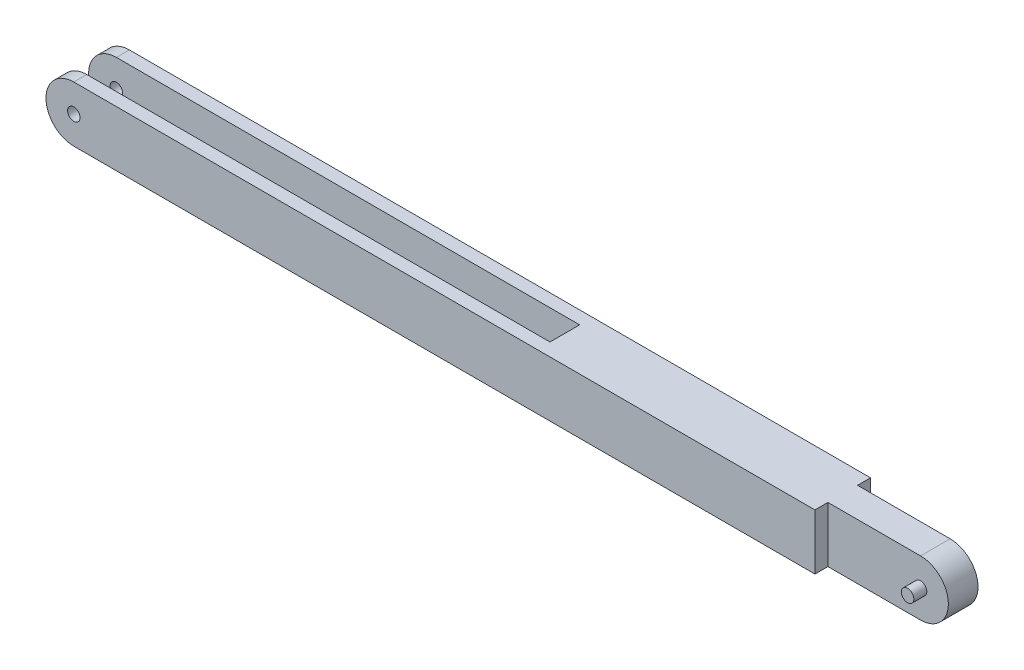
ISO-10303-21;
HEADER;
FILE_DESCRIPTION(('STEP AP214'),'2;1');
FILE_NAME('part.step','',(''),(''),'','','');
FILE_SCHEMA(('AUTOMOTIVE_DESIGN { 1 0 10303 214 1 1 1 1 }'));
ENDSEC;
DATA;
#1=APPLICATION_CONTEXT('core data for automotive mechanical design processes');
#2=APPLICATION_PROTOCOL_DEFINITION('international standard','automotive_design',2000,#1);
#3=PRODUCT_CONTEXT('',#1,'mechanical');
#4=PRODUCT('Part','Part','',(#3));
#5=PRODUCT_RELATED_PRODUCT_CATEGORY('part','',(#4));
#6=PRODUCT_DEFINITION_FORMATION('','',#4);
#7=PRODUCT_DEFINITION_CONTEXT('part definition',#1,'design');
#8=PRODUCT_DEFINITION('design','',#6,#7);
#9=PRODUCT_DEFINITION_SHAPE('','',#8);
#10=(LENGTH_UNIT() NAMED_UNIT(*) SI_UNIT(.MILLI.,.METRE.));
#11=(NAMED_UNIT(*) PLANE_ANGLE_UNIT() SI_UNIT($,.RADIAN.));
#12=(NAMED_UNIT(*) SI_UNIT($,.STERADIAN.) SOLID_ANGLE_UNIT());
#13=UNCERTAINTY_MEASURE_WITH_UNIT(LENGTH_MEASURE(1.E-05),#10,'distance_accuracy_value','');
#14=(GEOMETRIC_REPRESENTATION_CONTEXT(3) GLOBAL_UNCERTAINTY_ASSIGNED_CONTEXT((#13)) GLOBAL_UNIT_ASSIGNED_CONTEXT((#10,
#11,#12)) REPRESENTATION_CONTEXT('',''));
#15=CARTESIAN_POINT('',(0.,0.,0.));
#16=DIRECTION('',(0.,0.,1.));
#17=DIRECTION('',(1.,0.,0.));
#18=AXIS2_PLACEMENT_3D('',#15,#16,#17);
#19=CARTESIAN_POINT('',(-225.,0.,15.));
#20=DIRECTION('',(0.,0.,-1.));
#21=DIRECTION('',(-1.,0.,0.));
#22=AXIS2_PLACEMENT_3D('',#19,#20,#21);
#23=CYLINDRICAL_SURFACE('',#22,15.);
#24=DIRECTION('',(0.,0.,-1.));
#25=VECTOR('',#24,1.);
#26=CARTESIAN_POINT('',(-225.,-15.,15.));
#27=LINE('',#26,#25);
#28=CARTESIAN_POINT('',(-225.,-15.0000000000001,-7.99999999999993));
#29=VERTEX_POINT('',#28);
#30=CARTESIAN_POINT('',(-225.,-15.,-15.));
#31=VERTEX_POINT('',#30);
#32=EDGE_CURVE('E226',#29,#31,#27,.T.);
#33=ORIENTED_EDGE('',*,*,#32,.F.);
#34=CARTESIAN_POINT('',(-225.,0.,-7.99999999999993));
#35=DIRECTION('',(0.,0.,-1.));
#36=DIRECTION('',(-1.,0.,0.));
#37=AXIS2_PLACEMENT_3D('',#34,#35,#36);
#38=CIRCLE('',#37,15.);
#39=CARTESIAN_POINT('',(-225.,15.,-7.99999999999993));
#40=VERTEX_POINT('',#39);
#41=EDGE_CURVE('E182',#29,#40,#38,.T.);
#42=ORIENTED_EDGE('',*,*,#41,.T.);
#43=DIRECTION('',(0.,0.,-1.));
#44=VECTOR('',#43,1.);
#45=CARTESIAN_POINT('',(-225.,15.,15.));
#46=LINE('',#45,#44);
#47=CARTESIAN_POINT('',(-225.,15.,-15.));
#48=VERTEX_POINT('',#47);
#49=EDGE_CURVE('E209',#40,#48,#46,.T.);
#50=ORIENTED_EDGE('',*,*,#49,.T.);
#51=CARTESIAN_POINT('',(-225.,0.,-15.));
#52=DIRECTION('',(0.,0.,1.));
#53=DIRECTION('',(1.,0.,0.));
#54=AXIS2_PLACEMENT_3D('',#51,#52,#53);
#55=CIRCLE('',#54,15.);
#56=EDGE_CURVE('E199',#48,#31,#55,.T.);
#57=ORIENTED_EDGE('',*,*,#56,.T.);
#58=EDGE_LOOP('',(#33,#42,#50,#57));
#59=FACE_BOUND('',#58,.T.);
#60=ADVANCED_FACE('F33',(#59),#23,.T.);
#61=CARTESIAN_POINT('',(-225.,0.,15.));
#62=DIRECTION('',(0.,0.,1.));
#63=DIRECTION('',(1.,0.,0.));
#64=AXIS2_PLACEMENT_3D('',#61,#62,#63);
#65=CYLINDRICAL_SURFACE('',#64,3.3782);
#66=CARTESIAN_POINT('',(-225.,0.,-7.99999999999993));
#67=DIRECTION('',(0.,0.,-1.));
#68=DIRECTION('',(-1.,0.,0.));
#69=AXIS2_PLACEMENT_3D('',#66,#67,#68);
#70=CIRCLE('',#69,3.3782);
#71=CARTESIAN_POINT('',(-228.3782,0.,-7.99999999999993));
#72=VERTEX_POINT('',#71);
#73=EDGE_CURVE('E181',#72,#72,#70,.F.);
#74=ORIENTED_EDGE('',*,*,#73,.T.);
#75=EDGE_LOOP('',(#74));
#76=FACE_BOUND('',#75,.T.);
#77=CARTESIAN_POINT('',(-225.,0.,-15.));
#78=DIRECTION('',(0.,0.,1.));
#79=DIRECTION('',(1.,0.,0.));
#80=AXIS2_PLACEMENT_3D('',#77,#78,#79);
#81=CIRCLE('',#80,3.3782);
#82=CARTESIAN_POINT('',(-221.6218,0.,-15.));
#83=VERTEX_POINT('',#82);
#84=EDGE_CURVE('E196',#83,#83,#81,.T.);
#85=ORIENTED_EDGE('',*,*,#84,.F.);
#86=EDGE_LOOP('',(#85));
#87=FACE_BOUND('',#86,.T.);
#88=ADVANCED_FACE('F280',(#76,#87),#65,.F.);
#89=CARTESIAN_POINT('',(-225.,15.,15.));
#90=VERTEX_POINT('',#89);
#91=CARTESIAN_POINT('',(-225.,15.,8.00000000000001));
#92=VERTEX_POINT('',#91);
#93=EDGE_CURVE('E217',#90,#92,#46,.T.);
#94=ORIENTED_EDGE('',*,*,#93,.T.);
#95=CARTESIAN_POINT('',(-225.,0.,8.00000000000001));
#96=DIRECTION('',(0.,0.,1.));
#97=DIRECTION('',(1.,0.,0.));
#98=AXIS2_PLACEMENT_3D('',#95,#96,#97);
#99=CIRCLE('',#98,15.);
#100=CARTESIAN_POINT('',(-225.,-15.0000000000001,8.00000000000001));
#101=VERTEX_POINT('',#100);
#102=EDGE_CURVE('E48',#92,#101,#99,.T.);
#103=ORIENTED_EDGE('',*,*,#102,.T.);
#104=CARTESIAN_POINT('',(-225.,-15.,15.));
#105=VERTEX_POINT('',#104);
#106=EDGE_CURVE('E142',#105,#101,#27,.T.);
#107=ORIENTED_EDGE('',*,*,#106,.F.);
#108=CARTESIAN_POINT('',(-225.,0.,15.));
#109=DIRECTION('',(0.,0.,1.));
#110=DIRECTION('',(1.,0.,0.));
#111=AXIS2_PLACEMENT_3D('',#108,#109,#110);
#112=CIRCLE('',#111,15.);
#113=EDGE_CURVE('E200',#90,#105,#112,.T.);
#114=ORIENTED_EDGE('',*,*,#113,.F.);
#115=EDGE_LOOP('',(#94,#103,#107,#114));
#116=FACE_BOUND('',#115,.T.);
#117=ADVANCED_FACE('F35',(#116),#23,.T.);
#118=CARTESIAN_POINT('',(-225.,-15.,15.));
#119=DIRECTION('',(0.,1.,0.));
#120=DIRECTION('',(-1.,0.,0.));
#121=AXIS2_PLACEMENT_3D('',#118,#119,#120);
#122=PLANE('',#121);
#123=DIRECTION('',(0.,0.,-1.));
#124=VECTOR('',#123,1.);
#125=CARTESIAN_POINT('',(25.,-15.,-7.99999999999999));
#126=LINE('',#125,#124);
#127=CARTESIAN_POINT('',(25.,-15.,8.00000000000001));
#128=VERTEX_POINT('',#127);
#129=CARTESIAN_POINT('',(25.,-15.,-7.99999999999999));
#130=VERTEX_POINT('',#129);
#131=EDGE_CURVE('E133',#128,#130,#126,.T.);
#132=ORIENTED_EDGE('',*,*,#131,.T.);
#133=DIRECTION('',(-1.,0.,0.));
#134=VECTOR('',#133,1.);
#135=CARTESIAN_POINT('',(-975.,-15.0000000000002,-7.99999999999976));
#136=LINE('',#135,#134);
#137=EDGE_CURVE('E130',#130,#29,#136,.T.);
#138=ORIENTED_EDGE('',*,*,#137,.T.);
#139=ORIENTED_EDGE('',*,*,#32,.T.);
#140=DIRECTION('',(1.,0.,0.));
#141=VECTOR('',#140,1.);
#142=CARTESIAN_POINT('',(-225.,-15.,-15.));
#143=LINE('',#142,#141);
#144=CARTESIAN_POINT('',(175.,-14.9999999999999,-15.));
#145=VERTEX_POINT('',#144);
#146=EDGE_CURVE('E212',#31,#145,#143,.T.);
#147=ORIENTED_EDGE('',*,*,#146,.T.);
#148=DIRECTION('',(0.,0.,1.));
#149=VECTOR('',#148,1.);
#150=CARTESIAN_POINT('',(175.,-15.,-28.9161112376696));
#151=LINE('',#150,#149);
#152=CARTESIAN_POINT('',(175.,-15.,-8.));
#153=VERTEX_POINT('',#152);
#154=EDGE_CURVE('E157',#145,#153,#151,.T.);
#155=ORIENTED_EDGE('',*,*,#154,.T.);
#156=DIRECTION('',(1.,0.,0.));
#157=VECTOR('',#156,1.);
#158=CARTESIAN_POINT('',(175.,-15.,-8.));
#159=LINE('',#158,#157);
#160=CARTESIAN_POINT('',(225.,-15.,-8.));
#161=VERTEX_POINT('',#160);
#162=EDGE_CURVE('E160',#153,#161,#159,.T.);
#163=ORIENTED_EDGE('',*,*,#162,.T.);
#164=DIRECTION('',(0.,0.,-1.));
#165=VECTOR('',#164,1.);
#166=CARTESIAN_POINT('',(225.,-14.9999999999999,15.));
#167=LINE('',#166,#165);
#168=CARTESIAN_POINT('',(225.,-15.,8.));
#169=VERTEX_POINT('',#168);
#170=EDGE_CURVE('E223',#169,#161,#167,.T.);
#171=ORIENTED_EDGE('',*,*,#170,.F.);
#172=DIRECTION('',(-1.,0.,0.));
#173=VECTOR('',#172,1.);
#174=CARTESIAN_POINT('',(175.,-15.,8.));
#175=LINE('',#174,#173);
#176=CARTESIAN_POINT('',(175.,-15.,8.));
#177=VERTEX_POINT('',#176);
#178=EDGE_CURVE('E173',#169,#177,#175,.T.);
#179=ORIENTED_EDGE('',*,*,#178,.T.);
#180=DIRECTION('',(0.,0.,1.));
#181=VECTOR('',#180,1.);
#182=CARTESIAN_POINT('',(175.,-15.,28.9161112376696));
#183=LINE('',#182,#181);
#184=CARTESIAN_POINT('',(175.,-15.,15.));
#185=VERTEX_POINT('',#184);
#186=EDGE_CURVE('E170',#177,#185,#183,.T.);
#187=ORIENTED_EDGE('',*,*,#186,.T.);
#188=DIRECTION('',(1.,0.,0.));
#189=VECTOR('',#188,1.);
#190=CARTESIAN_POINT('',(-225.,-15.,15.));
#191=LINE('',#190,#189);
#192=EDGE_CURVE('E203',#105,#185,#191,.T.);
#193=ORIENTED_EDGE('',*,*,#192,.F.);
#194=ORIENTED_EDGE('',*,*,#106,.T.);
#195=DIRECTION('',(1.,0.,0.));
#196=VECTOR('',#195,1.);
#197=CARTESIAN_POINT('',(-975.,-15.0000000000002,8.00000000000001));
#198=LINE('',#197,#196);
#199=EDGE_CURVE('E124',#101,#128,#198,.T.);
#200=ORIENTED_EDGE('',*,*,#199,.T.);
#201=EDGE_LOOP('',(#132,#138,#139,#147,#155,#163,#171,#179,#187,#193,#194,#200));
#202=FACE_BOUND('',#201,.T.);
#203=ADVANCED_FACE('F140',(#202),#122,.F.);
#204=CARTESIAN_POINT('',(225.,0.,15.));
#205=DIRECTION('',(0.,0.,-1.));
#206=DIRECTION('',(-1.,0.,0.));
#207=AXIS2_PLACEMENT_3D('',#204,#205,#206);
#208=CYLINDRICAL_SURFACE('',#207,15.);
#209=ORIENTED_EDGE('',*,*,#170,.T.);
#210=CARTESIAN_POINT('',(225.,0.,-8.));
#211=DIRECTION('',(0.,0.,1.));
#212=DIRECTION('',(1.,0.,0.));
#213=AXIS2_PLACEMENT_3D('',#210,#211,#212);
#214=CIRCLE('',#213,15.);
#215=CARTESIAN_POINT('',(225.,15.0000000000001,-8.));
#216=VERTEX_POINT('',#215);
#217=EDGE_CURVE('E190',#161,#216,#214,.T.);
#218=ORIENTED_EDGE('',*,*,#217,.T.);
#219=DIRECTION('',(0.,0.,-1.));
#220=VECTOR('',#219,1.);
#221=CARTESIAN_POINT('',(225.,15.0000000000001,15.));
#222=LINE('',#221,#220);
#223=CARTESIAN_POINT('',(225.,15.0000000000001,8.));
#224=VERTEX_POINT('',#223);
#225=EDGE_CURVE('E220',#224,#216,#222,.T.);
#226=ORIENTED_EDGE('',*,*,#225,.F.);
#227=CARTESIAN_POINT('',(225.,0.,8.));
#228=DIRECTION('',(0.,0.,-1.));
#229=DIRECTION('',(-1.,0.,0.));
#230=AXIS2_PLACEMENT_3D('',#227,#228,#229);
#231=CIRCLE('',#230,15.);
#232=EDGE_CURVE('E186',#224,#169,#231,.T.);
#233=ORIENTED_EDGE('',*,*,#232,.T.);
#234=EDGE_LOOP('',(#209,#218,#226,#233));
#235=FACE_BOUND('',#234,.T.);
#236=ADVANCED_FACE('F256',(#235),#208,.T.);
#237=CARTESIAN_POINT('',(-225.,15.,15.));
#238=DIRECTION('',(0.,-1.,0.));
#239=DIRECTION('',(1.,0.,0.));
#240=AXIS2_PLACEMENT_3D('',#237,#238,#239);
#241=PLANE('',#240);
#242=ORIENTED_EDGE('',*,*,#49,.F.);
#243=DIRECTION('',(-1.,0.,0.));
#244=VECTOR('',#243,1.);
#245=CARTESIAN_POINT('',(-975.,14.9999999999999,-7.99999999999976));
#246=LINE('',#245,#244);
#247=CARTESIAN_POINT('',(25.,15.,-7.99999999999999));
#248=VERTEX_POINT('',#247);
#249=EDGE_CURVE('E143',#248,#40,#246,.T.);
#250=ORIENTED_EDGE('',*,*,#249,.F.);
#251=DIRECTION('',(0.,0.,-1.));
#252=VECTOR('',#251,1.);
#253=CARTESIAN_POINT('',(25.,15.,-7.99999999999999));
#254=LINE('',#253,#252);
#255=CARTESIAN_POINT('',(25.,15.,8.00000000000001));
#256=VERTEX_POINT('',#255);
#257=EDGE_CURVE('E145',#256,#248,#254,.T.);
#258=ORIENTED_EDGE('',*,*,#257,.F.);
#259=DIRECTION('',(1.,0.,0.));
#260=VECTOR('',#259,1.);
#261=CARTESIAN_POINT('',(-975.,14.9999999999999,8.00000000000001));
#262=LINE('',#261,#260);
#263=EDGE_CURVE('E125',#92,#256,#262,.T.);
#264=ORIENTED_EDGE('',*,*,#263,.F.);
#265=ORIENTED_EDGE('',*,*,#93,.F.);
#266=DIRECTION('',(-1.,0.,0.));
#267=VECTOR('',#266,1.);
#268=CARTESIAN_POINT('',(-225.,15.,15.));
#269=LINE('',#268,#267);
#270=CARTESIAN_POINT('',(175.,15.0000000000001,15.));
#271=VERTEX_POINT('',#270);
#272=EDGE_CURVE('E207',#271,#90,#269,.T.);
#273=ORIENTED_EDGE('',*,*,#272,.F.);
#274=DIRECTION('',(0.,0.,1.));
#275=VECTOR('',#274,1.);
#276=CARTESIAN_POINT('',(175.,15.0000000000001,28.9161112376696));
#277=LINE('',#276,#275);
#278=CARTESIAN_POINT('',(175.,15.0000000000001,8.));
#279=VERTEX_POINT('',#278);
#280=EDGE_CURVE('E55',#279,#271,#277,.T.);
#281=ORIENTED_EDGE('',*,*,#280,.F.);
#282=DIRECTION('',(-1.,0.,0.));
#283=VECTOR('',#282,1.);
#284=CARTESIAN_POINT('',(175.,15.0000000000001,8.));
#285=LINE('',#284,#283);
#286=EDGE_CURVE('E174',#224,#279,#285,.T.);
#287=ORIENTED_EDGE('',*,*,#286,.F.);
#288=ORIENTED_EDGE('',*,*,#225,.T.);
#289=DIRECTION('',(1.,0.,0.));
#290=VECTOR('',#289,1.);
#291=CARTESIAN_POINT('',(175.,15.0000000000001,-8.));
#292=LINE('',#291,#290);
#293=CARTESIAN_POINT('',(175.,15.0000000000001,-8.));
#294=VERTEX_POINT('',#293);
#295=EDGE_CURVE('E161',#294,#216,#292,.T.);
#296=ORIENTED_EDGE('',*,*,#295,.F.);
#297=DIRECTION('',(0.,0.,1.));
#298=VECTOR('',#297,1.);
#299=CARTESIAN_POINT('',(175.,15.0000000000001,-28.9161112376696));
#300=LINE('',#299,#298);
#301=CARTESIAN_POINT('',(175.,15.0000000000001,-15.));
#302=VERTEX_POINT('',#301);
#303=EDGE_CURVE('E164',#302,#294,#300,.T.);
#304=ORIENTED_EDGE('',*,*,#303,.F.);
#305=DIRECTION('',(-1.,0.,0.));
#306=VECTOR('',#305,1.);
#307=CARTESIAN_POINT('',(-225.,15.,-15.));
#308=LINE('',#307,#306);
#309=EDGE_CURVE('E204',#302,#48,#308,.T.);
#310=ORIENTED_EDGE('',*,*,#309,.T.);
#311=EDGE_LOOP('',(#242,#250,#258,#264,#265,#273,#281,#287,#288,#296,#304,#310));
#312=FACE_BOUND('',#311,.T.);
#313=ADVANCED_FACE('F248',(#312),#241,.F.);
#314=CARTESIAN_POINT('',(-225.,0.,15.));
#315=DIRECTION('',(0.,0.,1.));
#316=DIRECTION('',(1.,0.,0.));
#317=AXIS2_PLACEMENT_3D('',#314,#315,#316);
#318=PLANE('',#317);
#319=DIRECTION('',(0.,-1.,0.));
#320=VECTOR('',#319,1.);
#321=CARTESIAN_POINT('',(175.,0.,15.));
#322=LINE('',#321,#320);
#323=EDGE_CURVE('E11',#271,#185,#322,.T.);
#324=ORIENTED_EDGE('',*,*,#323,.F.);
#325=ORIENTED_EDGE('',*,*,#272,.T.);
#326=ORIENTED_EDGE('',*,*,#113,.T.);
#327=ORIENTED_EDGE('',*,*,#192,.T.);
#328=EDGE_LOOP('',(#324,#325,#326,#327));
#329=FACE_BOUND('',#328,.T.);
#330=CARTESIAN_POINT('',(-225.,0.,15.));
#331=DIRECTION('',(0.,0.,1.));
#332=DIRECTION('',(1.,0.,0.));
#333=AXIS2_PLACEMENT_3D('',#330,#331,#332);
#334=CIRCLE('',#333,3.3782);
#335=CARTESIAN_POINT('',(-221.6218,0.,15.));
#336=VERTEX_POINT('',#335);
#337=EDGE_CURVE('E193',#336,#336,#334,.T.);
#338=ORIENTED_EDGE('',*,*,#337,.F.);
#339=EDGE_LOOP('',(#338));
#340=FACE_BOUND('',#339,.T.);
#341=ADVANCED_FACE('F265',(#329,#340),#318,.T.);
#342=CARTESIAN_POINT('',(-225.,0.,-15.));
#343=DIRECTION('',(0.,0.,1.));
#344=DIRECTION('',(1.,0.,0.));
#345=AXIS2_PLACEMENT_3D('',#342,#343,#344);
#346=PLANE('',#345);
#347=ORIENTED_EDGE('',*,*,#84,.T.);
#348=EDGE_LOOP('',(#347));
#349=FACE_BOUND('',#348,.T.);
#350=ORIENTED_EDGE('',*,*,#309,.F.);
#351=DIRECTION('',(0.,-1.,0.));
#352=VECTOR('',#351,1.);
#353=CARTESIAN_POINT('',(175.,0.,-15.));
#354=LINE('',#353,#352);
#355=EDGE_CURVE('E41',#302,#145,#354,.T.);
#356=ORIENTED_EDGE('',*,*,#355,.T.);
#357=ORIENTED_EDGE('',*,*,#146,.F.);
#358=ORIENTED_EDGE('',*,*,#56,.F.);
#359=EDGE_LOOP('',(#350,#356,#357,#358));
#360=FACE_BOUND('',#359,.T.);
#361=ADVANCED_FACE('F239',(#349,#360),#346,.F.);
#362=CARTESIAN_POINT('',(-225.,0.,8.00000000000001));
#363=DIRECTION('',(0.,0.,1.));
#364=DIRECTION('',(1.,0.,0.));
#365=AXIS2_PLACEMENT_3D('',#362,#363,#364);
#366=CIRCLE('',#365,3.3782);
#367=CARTESIAN_POINT('',(-221.6218,0.,8.00000000000001));
#368=VERTEX_POINT('',#367);
#369=EDGE_CURVE('E155',#368,#368,#366,.F.);
#370=ORIENTED_EDGE('',*,*,#369,.T.);
#371=EDGE_LOOP('',(#370));
#372=FACE_BOUND('',#371,.T.);
#373=ORIENTED_EDGE('',*,*,#337,.T.);
#374=EDGE_LOOP('',(#373));
#375=FACE_BOUND('',#374,.T.);
#376=ADVANCED_FACE('F285',(#372,#375),#65,.F.);
#377=CARTESIAN_POINT('',(-975.,-15.0000000000002,-7.99999999999976));
#378=DIRECTION('',(0.,0.,-1.));
#379=DIRECTION('',(-1.,0.,0.));
#380=AXIS2_PLACEMENT_3D('',#377,#378,#379);
#381=PLANE('',#380);
#382=ORIENTED_EDGE('',*,*,#73,.F.);
#383=EDGE_LOOP('',(#382));
#384=FACE_BOUND('',#383,.T.);
#385=ORIENTED_EDGE('',*,*,#137,.F.);
#386=DIRECTION('',(0.,1.,0.));
#387=VECTOR('',#386,1.);
#388=CARTESIAN_POINT('',(25.,-15.,-7.99999999999999));
#389=LINE('',#388,#387);
#390=EDGE_CURVE('E129',#130,#248,#389,.T.);
#391=ORIENTED_EDGE('',*,*,#390,.T.);
#392=ORIENTED_EDGE('',*,*,#249,.T.);
#393=ORIENTED_EDGE('',*,*,#41,.F.);
#394=EDGE_LOOP('',(#385,#391,#392,#393));
#395=FACE_BOUND('',#394,.T.);
#396=ADVANCED_FACE('F303',(#384,#395),#381,.F.);
#397=CARTESIAN_POINT('',(-975.,-15.0000000000002,8.00000000000001));
#398=DIRECTION('',(0.,0.,1.));
#399=DIRECTION('',(1.,0.,0.));
#400=AXIS2_PLACEMENT_3D('',#397,#398,#399);
#401=PLANE('',#400);
#402=ORIENTED_EDGE('',*,*,#369,.F.);
#403=EDGE_LOOP('',(#402));
#404=FACE_BOUND('',#403,.T.);
#405=ORIENTED_EDGE('',*,*,#263,.T.);
#406=DIRECTION('',(0.,1.,0.));
#407=VECTOR('',#406,1.);
#408=CARTESIAN_POINT('',(25.,-15.,8.00000000000001));
#409=LINE('',#408,#407);
#410=EDGE_CURVE('E120',#128,#256,#409,.T.);
#411=ORIENTED_EDGE('',*,*,#410,.F.);
#412=ORIENTED_EDGE('',*,*,#199,.F.);
#413=ORIENTED_EDGE('',*,*,#102,.F.);
#414=EDGE_LOOP('',(#405,#411,#412,#413));
#415=FACE_BOUND('',#414,.T.);
#416=ADVANCED_FACE('F122',(#404,#415),#401,.F.);
#417=CARTESIAN_POINT('',(25.,-15.,-7.99999999999999));
#418=DIRECTION('',(1.,0.,0.));
#419=DIRECTION('',(0.,1.,0.));
#420=AXIS2_PLACEMENT_3D('',#417,#418,#419);
#421=PLANE('',#420);
#422=ORIENTED_EDGE('',*,*,#257,.T.);
#423=ORIENTED_EDGE('',*,*,#390,.F.);
#424=ORIENTED_EDGE('',*,*,#131,.F.);
#425=ORIENTED_EDGE('',*,*,#410,.T.);
#426=EDGE_LOOP('',(#422,#423,#424,#425));
#427=FACE_BOUND('',#426,.T.);
#428=ADVANCED_FACE('F134',(#427),#421,.F.);
#429=CARTESIAN_POINT('',(175.,-15.,8.));
#430=DIRECTION('',(0.,0.,-1.));
#431=DIRECTION('',(-1.,0.,0.));
#432=AXIS2_PLACEMENT_3D('',#429,#430,#431);
#433=PLANE('',#432);
#434=CARTESIAN_POINT('',(225.,0.,8.));
#435=DIRECTION('',(0.,0.,-1.));
#436=DIRECTION('',(-1.,0.,0.));
#437=AXIS2_PLACEMENT_3D('',#434,#435,#436);
#438=CIRCLE('',#437,3.3782);
#439=CARTESIAN_POINT('',(221.6218,0.,8.));
#440=VERTEX_POINT('',#439);
#441=EDGE_CURVE('E185',#440,#440,#438,.F.);
#442=ORIENTED_EDGE('',*,*,#441,.F.);
#443=EDGE_LOOP('',(#442));
#444=FACE_BOUND('',#443,.T.);
#445=ORIENTED_EDGE('',*,*,#286,.T.);
#446=DIRECTION('',(0.,1.,0.));
#447=VECTOR('',#446,1.);
#448=CARTESIAN_POINT('',(175.,-15.,8.));
#449=LINE('',#448,#447);
#450=EDGE_CURVE('E166',#177,#279,#449,.T.);
#451=ORIENTED_EDGE('',*,*,#450,.F.);
#452=ORIENTED_EDGE('',*,*,#178,.F.);
#453=ORIENTED_EDGE('',*,*,#232,.F.);
#454=EDGE_LOOP('',(#445,#451,#452,#453));
#455=FACE_BOUND('',#454,.T.);
#456=ADVANCED_FACE('F260',(#444,#455),#433,.F.);
#457=CARTESIAN_POINT('',(175.,-15.,28.9161112376696));
#458=DIRECTION('',(-1.,0.,0.));
#459=DIRECTION('',(0.,-1.,0.));
#460=AXIS2_PLACEMENT_3D('',#457,#458,#459);
#461=PLANE('',#460);
#462=ORIENTED_EDGE('',*,*,#323,.T.);
#463=ORIENTED_EDGE('',*,*,#186,.F.);
#464=ORIENTED_EDGE('',*,*,#450,.T.);
#465=ORIENTED_EDGE('',*,*,#280,.T.);
#466=EDGE_LOOP('',(#462,#463,#464,#465));
#467=FACE_BOUND('',#466,.T.);
#468=ADVANCED_FACE('F268',(#467),#461,.F.);
#469=CARTESIAN_POINT('',(175.,-15.,-28.9161112376696));
#470=DIRECTION('',(-1.,0.,0.));
#471=DIRECTION('',(0.,-1.,0.));
#472=AXIS2_PLACEMENT_3D('',#469,#470,#471);
#473=PLANE('',#472);
#474=ORIENTED_EDGE('',*,*,#303,.T.);
#475=DIRECTION('',(0.,1.,0.));
#476=VECTOR('',#475,1.);
#477=CARTESIAN_POINT('',(175.,-15.,-8.));
#478=LINE('',#477,#476);
#479=EDGE_CURVE('E153',#153,#294,#478,.T.);
#480=ORIENTED_EDGE('',*,*,#479,.F.);
#481=ORIENTED_EDGE('',*,*,#154,.F.);
#482=ORIENTED_EDGE('',*,*,#355,.F.);
#483=EDGE_LOOP('',(#474,#480,#481,#482));
#484=FACE_BOUND('',#483,.T.);
#485=ADVANCED_FACE('F250',(#484),#473,.F.);
#486=CARTESIAN_POINT('',(175.,-15.,-8.));
#487=DIRECTION('',(0.,0.,1.));
#488=DIRECTION('',(1.,0.,0.));
#489=AXIS2_PLACEMENT_3D('',#486,#487,#488);
#490=PLANE('',#489);
#491=CARTESIAN_POINT('',(225.,0.,-8.));
#492=DIRECTION('',(0.,0.,1.));
#493=DIRECTION('',(1.,0.,0.));
#494=AXIS2_PLACEMENT_3D('',#491,#492,#493);
#495=CIRCLE('',#494,3.3782);
#496=CARTESIAN_POINT('',(228.3782,0.,-8.));
#497=VERTEX_POINT('',#496);
#498=EDGE_CURVE('E189',#497,#497,#495,.F.);
#499=ORIENTED_EDGE('',*,*,#498,.F.);
#500=EDGE_LOOP('',(#499));
#501=FACE_BOUND('',#500,.T.);
#502=ORIENTED_EDGE('',*,*,#162,.F.);
#503=ORIENTED_EDGE('',*,*,#479,.T.);
#504=ORIENTED_EDGE('',*,*,#295,.T.);
#505=ORIENTED_EDGE('',*,*,#217,.F.);
#506=EDGE_LOOP('',(#502,#503,#504,#505));
#507=FACE_BOUND('',#506,.T.);
#508=ADVANCED_FACE('F253',(#501,#507),#490,.F.);
#509=CARTESIAN_POINT('',(-225.,0.,-15.));
#510=DIRECTION('',(0.,0.,1.));
#511=DIRECTION('',(1.,0.,0.));
#512=AXIS2_PLACEMENT_3D('',#509,#510,#511);
#513=PLANE('',#512);
#514=CARTESIAN_POINT('',(225.,0.,-15.));
#515=DIRECTION('',(0.,0.,1.));
#516=DIRECTION('',(1.,0.,0.));
#517=AXIS2_PLACEMENT_3D('',#514,#515,#516);
#518=CIRCLE('',#517,3.37819999999999);
#519=CARTESIAN_POINT('',(228.3782,0.,-15.));
#520=VERTEX_POINT('',#519);
#521=EDGE_CURVE('E349',#520,#520,#518,.F.);
#522=ORIENTED_EDGE('',*,*,#521,.T.);
#523=EDGE_LOOP('',(#522));
#524=FACE_BOUND('',#523,.T.);
#525=ADVANCED_FACE('F322',(#524),#513,.F.);
#526=CARTESIAN_POINT('',(225.,0.,24.5549925128176));
#527=DIRECTION('',(0.,0.,-1.));
#528=DIRECTION('',(-1.,0.,0.));
#529=AXIS2_PLACEMENT_3D('',#526,#527,#528);
#530=CYLINDRICAL_SURFACE('',#529,3.37819999999999);
#531=ORIENTED_EDGE('',*,*,#521,.F.);
#532=EDGE_LOOP('',(#531));
#533=FACE_BOUND('',#532,.T.);
#534=ORIENTED_EDGE('',*,*,#498,.T.);
#535=EDGE_LOOP('',(#534));
#536=FACE_BOUND('',#535,.T.);
#537=ADVANCED_FACE('F327',(#533,#536),#530,.T.);
#538=CARTESIAN_POINT('',(225.,0.,15.));
#539=DIRECTION('',(0.,0.,1.));
#540=DIRECTION('',(1.,0.,0.));
#541=AXIS2_PLACEMENT_3D('',#538,#539,#540);
#542=CIRCLE('',#541,3.37819999999999);
#543=CARTESIAN_POINT('',(228.3782,0.,15.));
#544=VERTEX_POINT('',#543);
#545=EDGE_CURVE('E148',#544,#544,#542,.T.);
#546=ORIENTED_EDGE('',*,*,#545,.F.);
#547=EDGE_LOOP('',(#546));
#548=FACE_BOUND('',#547,.T.);
#549=ORIENTED_EDGE('',*,*,#441,.T.);
#550=EDGE_LOOP('',(#549));
#551=FACE_BOUND('',#550,.T.);
#552=ADVANCED_FACE('F333',(#548,#551),#530,.T.);
#553=CARTESIAN_POINT('',(-225.,0.,15.));
#554=DIRECTION('',(0.,0.,1.));
#555=DIRECTION('',(1.,0.,0.));
#556=AXIS2_PLACEMENT_3D('',#553,#554,#555);
#557=PLANE('',#556);
#558=ORIENTED_EDGE('',*,*,#545,.T.);
#559=EDGE_LOOP('',(#558));
#560=FACE_BOUND('',#559,.T.);
#561=ADVANCED_FACE('F339',(#560),#557,.T.);
#562=CLOSED_SHELL('',(#60,#88,#117,#203,#236,#313,#341,#361,#376,#396,#416,#428,#456,#468,#485,
#508,#525,#537,#552,#561));
#563=MANIFOLD_SOLID_BREP('B2',#562);
#564=ADVANCED_BREP_SHAPE_REPRESENTATION('',(#18,#563),#14);
#565=SHAPE_DEFINITION_REPRESENTATION(#9,#564);
ENDSEC;
END-ISO-10303-21;
